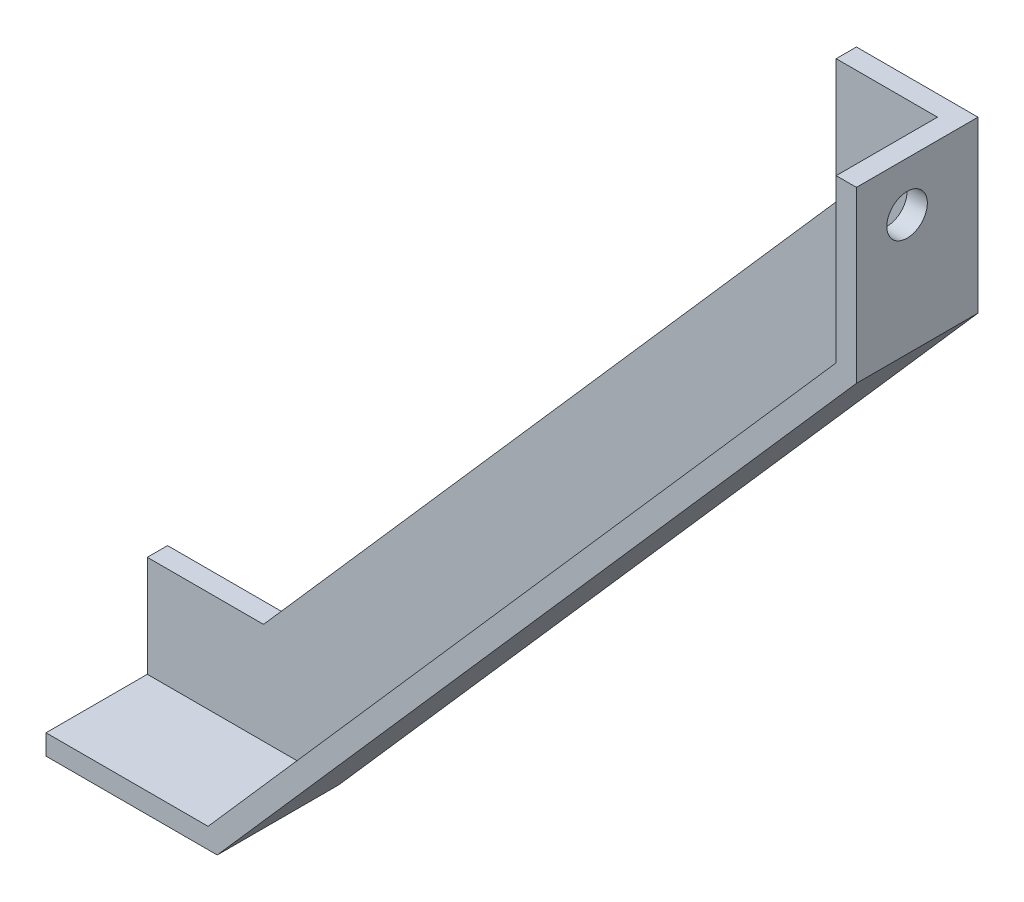
ISO-10303-21;
HEADER;
FILE_DESCRIPTION(('STEP AP214'),'2;1');
FILE_NAME('part.step','',(''),(''),'','','');
FILE_SCHEMA(('AUTOMOTIVE_DESIGN { 1 0 10303 214 1 1 1 1 }'));
ENDSEC;
DATA;
#1=APPLICATION_CONTEXT('core data for automotive mechanical design processes');
#2=APPLICATION_PROTOCOL_DEFINITION('international standard','automotive_design',2000,#1);
#3=PRODUCT_CONTEXT('',#1,'mechanical');
#4=PRODUCT('Part','Part','',(#3));
#5=PRODUCT_RELATED_PRODUCT_CATEGORY('part','',(#4));
#6=PRODUCT_DEFINITION_FORMATION('','',#4);
#7=PRODUCT_DEFINITION_CONTEXT('part definition',#1,'design');
#8=PRODUCT_DEFINITION('design','',#6,#7);
#9=PRODUCT_DEFINITION_SHAPE('','',#8);
#10=(LENGTH_UNIT() NAMED_UNIT(*) SI_UNIT(.MILLI.,.METRE.));
#11=(NAMED_UNIT(*) PLANE_ANGLE_UNIT() SI_UNIT($,.RADIAN.));
#12=(NAMED_UNIT(*) SI_UNIT($,.STERADIAN.) SOLID_ANGLE_UNIT());
#13=UNCERTAINTY_MEASURE_WITH_UNIT(LENGTH_MEASURE(1.E-05),#10,'distance_accuracy_value','');
#14=(GEOMETRIC_REPRESENTATION_CONTEXT(3) GLOBAL_UNCERTAINTY_ASSIGNED_CONTEXT((#13)) GLOBAL_UNIT_ASSIGNED_CONTEXT((#10,
#11,#12)) REPRESENTATION_CONTEXT('',''));
#15=CARTESIAN_POINT('',(0.,0.,0.));
#16=DIRECTION('',(0.,0.,1.));
#17=DIRECTION('',(1.,0.,0.));
#18=AXIS2_PLACEMENT_3D('',#15,#16,#17);
#19=CARTESIAN_POINT('',(-3.175,-25.4,19.05));
#20=DIRECTION('',(-1.,0.,0.));
#21=DIRECTION('',(0.,-1.,0.));
#22=AXIS2_PLACEMENT_3D('',#19,#20,#21);
#23=PLANE('',#22);
#24=DIRECTION('',(0.,0.,-1.));
#25=VECTOR('',#24,1.);
#26=CARTESIAN_POINT('',(-3.175,0.,19.05));
#27=LINE('',#26,#25);
#28=CARTESIAN_POINT('',(-3.175,0.,19.05));
#29=VERTEX_POINT('',#28);
#30=CARTESIAN_POINT('',(-3.175,0.,3.175));
#31=VERTEX_POINT('',#30);
#32=EDGE_CURVE('E144',#29,#31,#27,.T.);
#33=ORIENTED_EDGE('',*,*,#32,.T.);
#34=DIRECTION('',(0.,-1.,0.));
#35=VECTOR('',#34,1.);
#36=CARTESIAN_POINT('',(-3.175,0.,3.175));
#37=LINE('',#36,#35);
#38=CARTESIAN_POINT('',(-3.175,-25.4,3.175));
#39=VERTEX_POINT('',#38);
#40=EDGE_CURVE('E181',#31,#39,#37,.T.);
#41=ORIENTED_EDGE('',*,*,#40,.T.);
#42=DIRECTION('',(0.,0.,-1.));
#43=VECTOR('',#42,1.);
#44=CARTESIAN_POINT('',(-3.175,-25.4,19.05));
#45=LINE('',#44,#43);
#46=CARTESIAN_POINT('',(-3.175,-25.4,19.05));
#47=VERTEX_POINT('',#46);
#48=EDGE_CURVE('E142',#47,#39,#45,.T.);
#49=ORIENTED_EDGE('',*,*,#48,.F.);
#50=DIRECTION('',(0.,1.,0.));
#51=VECTOR('',#50,1.);
#52=CARTESIAN_POINT('',(-3.175,-25.4,19.05));
#53=LINE('',#52,#51);
#54=EDGE_CURVE('E138',#47,#29,#53,.T.);
#55=ORIENTED_EDGE('',*,*,#54,.T.);
#56=EDGE_LOOP('',(#33,#41,#49,#55));
#57=FACE_BOUND('',#56,.T.);
#58=CARTESIAN_POINT('',(-3.175,-7.690689216,11.1125));
#59=DIRECTION('',(1.,0.,0.));
#60=DIRECTION('',(0.,1.,0.));
#61=AXIS2_PLACEMENT_3D('',#58,#59,#60);
#62=CIRCLE('',#61,3.175);
#63=CARTESIAN_POINT('',(-3.175,-4.515689216,11.1125));
#64=VERTEX_POINT('',#63);
#65=EDGE_CURVE('E236',#64,#64,#62,.T.);
#66=ORIENTED_EDGE('',*,*,#65,.T.);
#67=EDGE_LOOP('',(#66));
#68=FACE_BOUND('',#67,.T.);
#69=ADVANCED_FACE('F40',(#57,#68),#23,.T.);
#70=CARTESIAN_POINT('',(-101.6,-137.517505,19.05));
#71=DIRECTION('',(-0.751505485627988,0.659726841254046,0.));
#72=DIRECTION('',(-0.659726841254046,-0.751505485627988,0.));
#73=AXIS2_PLACEMENT_3D('',#70,#71,#72);
#74=PLANE('',#73);
#75=ORIENTED_EDGE('',*,*,#48,.T.);
#76=DIRECTION('',(-0.659726841254046,-0.751505485627988,0.));
#77=VECTOR('',#76,1.);
#78=CARTESIAN_POINT('',(10.799909270149,-9.48095544861091,3.175));
#79=LINE('',#78,#77);
#80=CARTESIAN_POINT('',(-101.6,-137.517505,3.175));
#81=VERTEX_POINT('',#80);
#82=EDGE_CURVE('E202',#39,#81,#79,.T.);
#83=ORIENTED_EDGE('',*,*,#82,.T.);
#84=DIRECTION('',(0.,0.,-1.));
#85=VECTOR('',#84,1.);
#86=CARTESIAN_POINT('',(-101.6,-137.517505,19.05));
#87=LINE('',#86,#85);
#88=CARTESIAN_POINT('',(-101.6,-137.517505,19.05));
#89=VERTEX_POINT('',#88);
#90=EDGE_CURVE('E109',#89,#81,#87,.T.);
#91=ORIENTED_EDGE('',*,*,#90,.F.);
#92=DIRECTION('',(0.659726841254046,0.751505485627988,0.));
#93=VECTOR('',#92,1.);
#94=CARTESIAN_POINT('',(-101.6,-137.517505,19.05));
#95=LINE('',#94,#93);
#96=EDGE_CURVE('E117',#89,#47,#95,.T.);
#97=ORIENTED_EDGE('',*,*,#96,.T.);
#98=EDGE_LOOP('',(#75,#83,#91,#97));
#99=FACE_BOUND('',#98,.T.);
#100=ADVANCED_FACE('F197',(#99),#74,.T.);
#101=CARTESIAN_POINT('',(-127.,-137.517505,19.05));
#102=DIRECTION('',(0.,1.,0.));
#103=DIRECTION('',(-1.,0.,0.));
#104=AXIS2_PLACEMENT_3D('',#101,#102,#103);
#105=PLANE('',#104);
#106=ORIENTED_EDGE('',*,*,#90,.T.);
#107=DIRECTION('',(-1.,0.,0.));
#108=VECTOR('',#107,1.);
#109=CARTESIAN_POINT('',(-1.32331551341659E-13,-137.517505,3.175));
#110=LINE('',#109,#108);
#111=CARTESIAN_POINT('',(-127.,-137.517505,3.175));
#112=VERTEX_POINT('',#111);
#113=EDGE_CURVE('E105',#81,#112,#110,.T.);
#114=ORIENTED_EDGE('',*,*,#113,.T.);
#115=DIRECTION('',(0.,0.,-1.));
#116=VECTOR('',#115,1.);
#117=CARTESIAN_POINT('',(-127.,-137.517505,19.05));
#118=LINE('',#117,#116);
#119=CARTESIAN_POINT('',(-127.,-137.517505,19.05));
#120=VERTEX_POINT('',#119);
#121=EDGE_CURVE('E98',#120,#112,#118,.T.);
#122=ORIENTED_EDGE('',*,*,#121,.F.);
#123=DIRECTION('',(1.,0.,0.));
#124=VECTOR('',#123,1.);
#125=CARTESIAN_POINT('',(-127.,-137.517505,19.05));
#126=LINE('',#125,#124);
#127=EDGE_CURVE('E102',#120,#89,#126,.T.);
#128=ORIENTED_EDGE('',*,*,#127,.T.);
#129=EDGE_LOOP('',(#106,#114,#122,#128));
#130=FACE_BOUND('',#129,.T.);
#131=ADVANCED_FACE('F101',(#130),#105,.T.);
#132=CARTESIAN_POINT('',(3.175,0.,19.05));
#133=DIRECTION('',(0.,-1.,0.));
#134=DIRECTION('',(0.,0.,-1.));
#135=AXIS2_PLACEMENT_3D('',#132,#133,#134);
#136=PLANE('',#135);
#137=DIRECTION('',(-1.,0.,0.));
#138=VECTOR('',#137,1.);
#139=CARTESIAN_POINT('',(3.175,0.,19.05));
#140=LINE('',#139,#138);
#141=CARTESIAN_POINT('',(0.,0.,19.05));
#142=VERTEX_POINT('',#141);
#143=EDGE_CURVE('E48',#142,#29,#140,.T.);
#144=ORIENTED_EDGE('',*,*,#143,.F.);
#145=DIRECTION('',(0.,0.,1.));
#146=VECTOR('',#145,1.);
#147=CARTESIAN_POINT('',(0.,0.,-127.));
#148=LINE('',#147,#146);
#149=CARTESIAN_POINT('',(0.,0.,0.));
#150=VERTEX_POINT('',#149);
#151=EDGE_CURVE('E158',#150,#142,#148,.T.);
#152=ORIENTED_EDGE('',*,*,#151,.F.);
#153=DIRECTION('',(-1.,0.,0.));
#154=VECTOR('',#153,1.);
#155=CARTESIAN_POINT('',(3.175,0.,0.));
#156=LINE('',#155,#154);
#157=CARTESIAN_POINT('',(-19.05,0.,0.));
#158=VERTEX_POINT('',#157);
#159=EDGE_CURVE('E148',#150,#158,#156,.T.);
#160=ORIENTED_EDGE('',*,*,#159,.T.);
#161=DIRECTION('',(0.,0.,-1.));
#162=VECTOR('',#161,1.);
#163=CARTESIAN_POINT('',(-19.05,0.,3.175));
#164=LINE('',#163,#162);
#165=CARTESIAN_POINT('',(-19.05,0.,3.175));
#166=VERTEX_POINT('',#165);
#167=EDGE_CURVE('E132',#166,#158,#164,.T.);
#168=ORIENTED_EDGE('',*,*,#167,.F.);
#169=DIRECTION('',(1.,0.,0.));
#170=VECTOR('',#169,1.);
#171=CARTESIAN_POINT('',(0.,0.,3.175));
#172=LINE('',#171,#170);
#173=EDGE_CURVE('E179',#166,#31,#172,.T.);
#174=ORIENTED_EDGE('',*,*,#173,.T.);
#175=ORIENTED_EDGE('',*,*,#32,.F.);
#176=EDGE_LOOP('',(#144,#152,#160,#168,#174,#175));
#177=FACE_BOUND('',#176,.T.);
#178=ADVANCED_FACE('F42',(#177),#136,.F.);
#179=CARTESIAN_POINT('',(0.,0.,19.05));
#180=DIRECTION('',(0.,0.,1.));
#181=DIRECTION('',(1.,0.,0.));
#182=AXIS2_PLACEMENT_3D('',#179,#180,#181);
#183=PLANE('',#182);
#184=DIRECTION('',(0.,-1.,0.));
#185=VECTOR('',#184,1.);
#186=CARTESIAN_POINT('',(0.,0.,19.05));
#187=LINE('',#186,#185);
#188=CARTESIAN_POINT('',(0.,-26.595904173962,19.05));
#189=VERTEX_POINT('',#188);
#190=EDGE_CURVE('E54',#142,#189,#187,.T.);
#191=ORIENTED_EDGE('',*,*,#190,.F.);
#192=ORIENTED_EDGE('',*,*,#143,.T.);
#193=ORIENTED_EDGE('',*,*,#54,.F.);
#194=ORIENTED_EDGE('',*,*,#96,.F.);
#195=ORIENTED_EDGE('',*,*,#127,.F.);
#196=DIRECTION('',(0.,1.,0.));
#197=VECTOR('',#196,1.);
#198=CARTESIAN_POINT('',(-127.,-140.692505,19.05));
#199=LINE('',#198,#197);
#200=CARTESIAN_POINT('',(-127.,-140.692505,19.05));
#201=VERTEX_POINT('',#200);
#202=EDGE_CURVE('E115',#201,#120,#199,.T.);
#203=ORIENTED_EDGE('',*,*,#202,.F.);
#204=DIRECTION('',(-1.,0.,0.));
#205=VECTOR('',#204,1.);
#206=CARTESIAN_POINT('',(-100.162396017489,-140.692505,19.05));
#207=LINE('',#206,#205);
#208=CARTESIAN_POINT('',(-100.162396017489,-140.692505,19.05));
#209=VERTEX_POINT('',#208);
#210=EDGE_CURVE('E121',#209,#201,#207,.T.);
#211=ORIENTED_EDGE('',*,*,#210,.F.);
#212=DIRECTION('',(-0.659726841254046,-0.751505485627988,0.));
#213=VECTOR('',#212,1.);
#214=CARTESIAN_POINT('',(0.,-26.595904173962,19.05));
#215=LINE('',#214,#213);
#216=EDGE_CURVE('E123',#189,#209,#215,.T.);
#217=ORIENTED_EDGE('',*,*,#216,.F.);
#218=EDGE_LOOP('',(#191,#192,#193,#194,#195,#203,#211,#217));
#219=FACE_BOUND('',#218,.T.);
#220=ADVANCED_FACE('F114',(#219),#183,.T.);
#221=CARTESIAN_POINT('',(0.,0.,0.));
#222=DIRECTION('',(0.,0.,1.));
#223=DIRECTION('',(1.,0.,0.));
#224=AXIS2_PLACEMENT_3D('',#221,#222,#223);
#225=PLANE('',#224);
#226=ORIENTED_EDGE('',*,*,#159,.F.);
#227=DIRECTION('',(0.,-1.,0.));
#228=VECTOR('',#227,1.);
#229=CARTESIAN_POINT('',(0.,0.,0.));
#230=LINE('',#229,#228);
#231=CARTESIAN_POINT('',(0.,-26.5959041739621,0.));
#232=VERTEX_POINT('',#231);
#233=EDGE_CURVE('E244',#150,#232,#230,.T.);
#234=ORIENTED_EDGE('',*,*,#233,.T.);
#235=DIRECTION('',(-0.659726841254046,-0.751505485627988,0.));
#236=VECTOR('',#235,1.);
#237=CARTESIAN_POINT('',(0.,-26.595904173962,0.));
#238=LINE('',#237,#236);
#239=CARTESIAN_POINT('',(-100.162396017489,-140.692505,0.));
#240=VERTEX_POINT('',#239);
#241=EDGE_CURVE('E135',#232,#240,#238,.T.);
#242=ORIENTED_EDGE('',*,*,#241,.T.);
#243=DIRECTION('',(-1.,0.,0.));
#244=VECTOR('',#243,1.);
#245=CARTESIAN_POINT('',(-100.162396017489,-140.692505,0.));
#246=LINE('',#245,#244);
#247=CARTESIAN_POINT('',(-127.,-140.692505,0.));
#248=VERTEX_POINT('',#247);
#249=EDGE_CURVE('E131',#240,#248,#246,.T.);
#250=ORIENTED_EDGE('',*,*,#249,.T.);
#251=DIRECTION('',(0.,1.,0.));
#252=VECTOR('',#251,1.);
#253=CARTESIAN_POINT('',(-127.,-140.692505,0.));
#254=LINE('',#253,#252);
#255=CARTESIAN_POINT('',(-127.,-121.642505,0.));
#256=VERTEX_POINT('',#255);
#257=EDGE_CURVE('E128',#248,#256,#254,.T.);
#258=ORIENTED_EDGE('',*,*,#257,.T.);
#259=DIRECTION('',(1.,0.,0.));
#260=VECTOR('',#259,1.);
#261=CARTESIAN_POINT('',(0.,-121.642505,0.));
#262=LINE('',#261,#260);
#263=CARTESIAN_POINT('',(-108.78801991256,-121.642505,0.));
#264=VERTEX_POINT('',#263);
#265=EDGE_CURVE('E183',#256,#264,#262,.T.);
#266=ORIENTED_EDGE('',*,*,#265,.T.);
#267=DIRECTION('',(0.659726841254046,0.751505485627988,0.));
#268=VECTOR('',#267,1.);
#269=CARTESIAN_POINT('',(-1.13024031419536,0.992208156297076,0.));
#270=LINE('',#269,#268);
#271=CARTESIAN_POINT('',(-19.05,-19.420479130185,0.));
#272=VERTEX_POINT('',#271);
#273=EDGE_CURVE('E178',#264,#272,#270,.T.);
#274=ORIENTED_EDGE('',*,*,#273,.T.);
#275=DIRECTION('',(0.,1.,0.));
#276=VECTOR('',#275,1.);
#277=CARTESIAN_POINT('',(-19.05,0.,0.));
#278=LINE('',#277,#276);
#279=EDGE_CURVE('E169',#272,#158,#278,.T.);
#280=ORIENTED_EDGE('',*,*,#279,.T.);
#281=EDGE_LOOP('',(#226,#234,#242,#250,#258,#266,#274,#280));
#282=FACE_BOUND('',#281,.T.);
#283=ADVANCED_FACE('F175',(#282),#225,.F.);
#284=CARTESIAN_POINT('',(0.,-7.690689216,11.1125));
#285=DIRECTION('',(1.,0.,0.));
#286=DIRECTION('',(0.,1.,0.));
#287=AXIS2_PLACEMENT_3D('',#284,#285,#286);
#288=CYLINDRICAL_SURFACE('',#287,3.175);
#289=CARTESIAN_POINT('',(0.,-7.690689216,11.1125));
#290=DIRECTION('',(-1.,0.,0.));
#291=DIRECTION('',(0.,0.,1.));
#292=AXIS2_PLACEMENT_3D('',#289,#290,#291);
#293=CIRCLE('',#292,3.175);
#294=CARTESIAN_POINT('',(0.,-7.690689216,14.2875));
#295=VERTEX_POINT('',#294);
#296=EDGE_CURVE('E239',#295,#295,#293,.F.);
#297=ORIENTED_EDGE('',*,*,#296,.T.);
#298=EDGE_LOOP('',(#297));
#299=FACE_BOUND('',#298,.T.);
#300=ORIENTED_EDGE('',*,*,#65,.F.);
#301=EDGE_LOOP('',(#300));
#302=FACE_BOUND('',#301,.T.);
#303=ADVANCED_FACE('F276',(#299,#302),#288,.F.);
#304=CARTESIAN_POINT('',(-127.,-140.692505,19.05));
#305=DIRECTION('',(-1.,0.,0.));
#306=DIRECTION('',(0.,-1.,0.));
#307=AXIS2_PLACEMENT_3D('',#304,#305,#306);
#308=PLANE('',#307);
#309=ORIENTED_EDGE('',*,*,#257,.F.);
#310=DIRECTION('',(0.,0.,-1.));
#311=VECTOR('',#310,1.);
#312=CARTESIAN_POINT('',(-127.,-140.692505,19.05));
#313=LINE('',#312,#311);
#314=EDGE_CURVE('E110',#201,#248,#313,.T.);
#315=ORIENTED_EDGE('',*,*,#314,.F.);
#316=ORIENTED_EDGE('',*,*,#202,.T.);
#317=ORIENTED_EDGE('',*,*,#121,.T.);
#318=DIRECTION('',(0.,1.,0.));
#319=VECTOR('',#318,1.);
#320=CARTESIAN_POINT('',(-127.,0.,3.175));
#321=LINE('',#320,#319);
#322=CARTESIAN_POINT('',(-127.,-121.642505,3.175));
#323=VERTEX_POINT('',#322);
#324=EDGE_CURVE('E252',#112,#323,#321,.T.);
#325=ORIENTED_EDGE('',*,*,#324,.T.);
#326=DIRECTION('',(0.,0.,-1.));
#327=VECTOR('',#326,1.);
#328=CARTESIAN_POINT('',(-127.,-121.642505,3.175));
#329=LINE('',#328,#327);
#330=EDGE_CURVE('E192',#323,#256,#329,.T.);
#331=ORIENTED_EDGE('',*,*,#330,.T.);
#332=EDGE_LOOP('',(#309,#315,#316,#317,#325,#331));
#333=FACE_BOUND('',#332,.T.);
#334=ADVANCED_FACE('F120',(#333),#308,.T.);
#335=CARTESIAN_POINT('',(-100.162396017489,-140.692505,19.05));
#336=DIRECTION('',(0.,-1.,0.));
#337=DIRECTION('',(1.,0.,0.));
#338=AXIS2_PLACEMENT_3D('',#335,#336,#337);
#339=PLANE('',#338);
#340=ORIENTED_EDGE('',*,*,#249,.F.);
#341=DIRECTION('',(0.,0.,-1.));
#342=VECTOR('',#341,1.);
#343=CARTESIAN_POINT('',(-100.162396017489,-140.692505,19.05));
#344=LINE('',#343,#342);
#345=EDGE_CURVE('E63',#209,#240,#344,.T.);
#346=ORIENTED_EDGE('',*,*,#345,.F.);
#347=ORIENTED_EDGE('',*,*,#210,.T.);
#348=ORIENTED_EDGE('',*,*,#314,.T.);
#349=EDGE_LOOP('',(#340,#346,#347,#348));
#350=FACE_BOUND('',#349,.T.);
#351=ADVANCED_FACE('F255',(#350),#339,.T.);
#352=CARTESIAN_POINT('',(0.,-26.595904173962,19.05));
#353=DIRECTION('',(0.751505485627988,-0.659726841254046,0.));
#354=DIRECTION('',(0.659726841254046,0.751505485627988,0.));
#355=AXIS2_PLACEMENT_3D('',#352,#353,#354);
#356=PLANE('',#355);
#357=ORIENTED_EDGE('',*,*,#241,.F.);
#358=DIRECTION('',(0.,0.,-1.));
#359=VECTOR('',#358,1.);
#360=CARTESIAN_POINT('',(0.,-26.595904173962,19.05));
#361=LINE('',#360,#359);
#362=EDGE_CURVE('E12',#189,#232,#361,.T.);
#363=ORIENTED_EDGE('',*,*,#362,.F.);
#364=ORIENTED_EDGE('',*,*,#216,.T.);
#365=ORIENTED_EDGE('',*,*,#345,.T.);
#366=EDGE_LOOP('',(#357,#363,#364,#365));
#367=FACE_BOUND('',#366,.T.);
#368=ADVANCED_FACE('F257',(#367),#356,.T.);
#369=CARTESIAN_POINT('',(-19.05,0.,3.175));
#370=DIRECTION('',(-1.,0.,0.));
#371=DIRECTION('',(0.,-1.,0.));
#372=AXIS2_PLACEMENT_3D('',#369,#370,#371);
#373=PLANE('',#372);
#374=ORIENTED_EDGE('',*,*,#279,.F.);
#375=DIRECTION('',(0.,0.,-1.));
#376=VECTOR('',#375,1.);
#377=CARTESIAN_POINT('',(-19.05,-19.420479130185,3.175));
#378=LINE('',#377,#376);
#379=CARTESIAN_POINT('',(-19.05,-19.420479130185,3.175));
#380=VERTEX_POINT('',#379);
#381=EDGE_CURVE('E172',#380,#272,#378,.T.);
#382=ORIENTED_EDGE('',*,*,#381,.F.);
#383=DIRECTION('',(0.,1.,0.));
#384=VECTOR('',#383,1.);
#385=CARTESIAN_POINT('',(-19.05,0.,3.175));
#386=LINE('',#385,#384);
#387=EDGE_CURVE('E171',#380,#166,#386,.T.);
#388=ORIENTED_EDGE('',*,*,#387,.T.);
#389=ORIENTED_EDGE('',*,*,#167,.T.);
#390=EDGE_LOOP('',(#374,#382,#388,#389));
#391=FACE_BOUND('',#390,.T.);
#392=ADVANCED_FACE('F167',(#391),#373,.T.);
#393=CARTESIAN_POINT('',(-1.13024031419536,0.992208156297076,3.175));
#394=DIRECTION('',(-0.751505485627988,0.659726841254046,0.));
#395=DIRECTION('',(-0.659726841254046,-0.751505485627989,0.));
#396=AXIS2_PLACEMENT_3D('',#393,#394,#395);
#397=PLANE('',#396);
#398=ORIENTED_EDGE('',*,*,#273,.F.);
#399=DIRECTION('',(0.,0.,-1.));
#400=VECTOR('',#399,1.);
#401=CARTESIAN_POINT('',(-108.78801991256,-121.642505,3.175));
#402=LINE('',#401,#400);
#403=CARTESIAN_POINT('',(-108.78801991256,-121.642505,3.175));
#404=VERTEX_POINT('',#403);
#405=EDGE_CURVE('E189',#404,#264,#402,.T.);
#406=ORIENTED_EDGE('',*,*,#405,.F.);
#407=DIRECTION('',(0.659726841254046,0.751505485627988,0.));
#408=VECTOR('',#407,1.);
#409=CARTESIAN_POINT('',(-1.13024031419536,0.992208156297076,3.175));
#410=LINE('',#409,#408);
#411=EDGE_CURVE('E227',#404,#380,#410,.T.);
#412=ORIENTED_EDGE('',*,*,#411,.T.);
#413=ORIENTED_EDGE('',*,*,#381,.T.);
#414=EDGE_LOOP('',(#398,#406,#412,#413));
#415=FACE_BOUND('',#414,.T.);
#416=ADVANCED_FACE('F225',(#415),#397,.T.);
#417=CARTESIAN_POINT('',(0.,-121.642505,3.175));
#418=DIRECTION('',(0.,1.,0.));
#419=DIRECTION('',(-1.,0.,0.));
#420=AXIS2_PLACEMENT_3D('',#417,#418,#419);
#421=PLANE('',#420);
#422=ORIENTED_EDGE('',*,*,#265,.F.);
#423=ORIENTED_EDGE('',*,*,#330,.F.);
#424=DIRECTION('',(1.,0.,0.));
#425=VECTOR('',#424,1.);
#426=CARTESIAN_POINT('',(0.,-121.642505,3.175));
#427=LINE('',#426,#425);
#428=EDGE_CURVE('E230',#323,#404,#427,.T.);
#429=ORIENTED_EDGE('',*,*,#428,.T.);
#430=ORIENTED_EDGE('',*,*,#405,.T.);
#431=EDGE_LOOP('',(#422,#423,#429,#430));
#432=FACE_BOUND('',#431,.T.);
#433=ADVANCED_FACE('F254',(#432),#421,.T.);
#434=CARTESIAN_POINT('',(0.,0.,3.175));
#435=DIRECTION('',(0.,0.,-1.));
#436=DIRECTION('',(1.,0.,0.));
#437=AXIS2_PLACEMENT_3D('',#434,#435,#436);
#438=PLANE('',#437);
#439=ORIENTED_EDGE('',*,*,#173,.F.);
#440=ORIENTED_EDGE('',*,*,#387,.F.);
#441=ORIENTED_EDGE('',*,*,#411,.F.);
#442=ORIENTED_EDGE('',*,*,#428,.F.);
#443=ORIENTED_EDGE('',*,*,#324,.F.);
#444=ORIENTED_EDGE('',*,*,#113,.F.);
#445=ORIENTED_EDGE('',*,*,#82,.F.);
#446=ORIENTED_EDGE('',*,*,#40,.F.);
#447=EDGE_LOOP('',(#439,#440,#441,#442,#443,#444,#445,#446));
#448=FACE_BOUND('',#447,.T.);
#449=ADVANCED_FACE('F232',(#448),#438,.F.);
#450=CARTESIAN_POINT('',(0.,0.,-127.));
#451=DIRECTION('',(-1.,0.,0.));
#452=DIRECTION('',(0.,0.,1.));
#453=AXIS2_PLACEMENT_3D('',#450,#451,#452);
#454=PLANE('',#453);
#455=ORIENTED_EDGE('',*,*,#151,.T.);
#456=ORIENTED_EDGE('',*,*,#190,.T.);
#457=ORIENTED_EDGE('',*,*,#362,.T.);
#458=ORIENTED_EDGE('',*,*,#233,.F.);
#459=EDGE_LOOP('',(#455,#456,#457,#458));
#460=FACE_BOUND('',#459,.T.);
#461=ORIENTED_EDGE('',*,*,#296,.F.);
#462=EDGE_LOOP('',(#461));
#463=FACE_BOUND('',#462,.T.);
#464=ADVANCED_FACE('F259',(#460,#463),#454,.F.);
#465=CLOSED_SHELL('',(#69,#100,#131,#178,#220,#283,#303,#334,#351,#368,#392,#416,#433,#449,#464));
#466=MANIFOLD_SOLID_BREP('B2',#465);
#467=ADVANCED_BREP_SHAPE_REPRESENTATION('',(#18,#466),#14);
#468=SHAPE_DEFINITION_REPRESENTATION(#9,#467);
ENDSEC;
END-ISO-10303-21;
